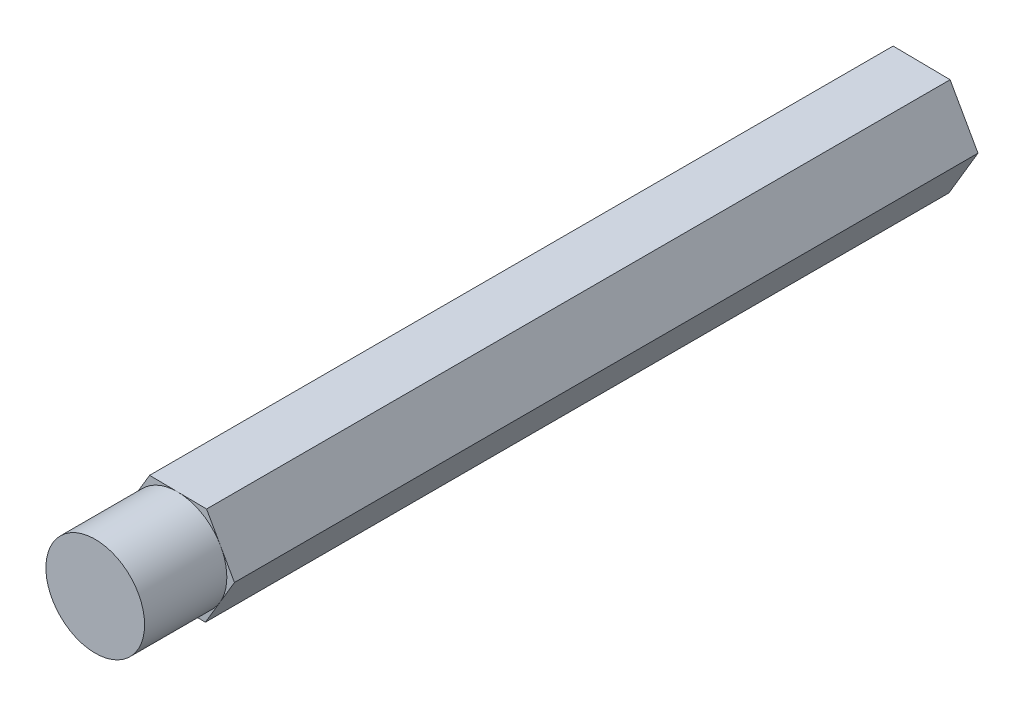
ISO-10303-21;
HEADER;
FILE_DESCRIPTION(('STEP AP214'),'2;1');
FILE_NAME('part.step','',(''),(''),'','','');
FILE_SCHEMA(('AUTOMOTIVE_DESIGN { 1 0 10303 214 1 1 1 1 }'));
ENDSEC;
DATA;
#1=APPLICATION_CONTEXT('core data for automotive mechanical design processes');
#2=APPLICATION_PROTOCOL_DEFINITION('international standard','automotive_design',2000,#1);
#3=PRODUCT_CONTEXT('',#1,'mechanical');
#4=PRODUCT('Part','Part','',(#3));
#5=PRODUCT_RELATED_PRODUCT_CATEGORY('part','',(#4));
#6=PRODUCT_DEFINITION_FORMATION('','',#4);
#7=PRODUCT_DEFINITION_CONTEXT('part definition',#1,'design');
#8=PRODUCT_DEFINITION('design','',#6,#7);
#9=PRODUCT_DEFINITION_SHAPE('','',#8);
#10=(LENGTH_UNIT() NAMED_UNIT(*) SI_UNIT(.MILLI.,.METRE.));
#11=(NAMED_UNIT(*) PLANE_ANGLE_UNIT() SI_UNIT($,.RADIAN.));
#12=(NAMED_UNIT(*) SI_UNIT($,.STERADIAN.) SOLID_ANGLE_UNIT());
#13=UNCERTAINTY_MEASURE_WITH_UNIT(LENGTH_MEASURE(1.E-05),#10,'distance_accuracy_value','');
#14=(GEOMETRIC_REPRESENTATION_CONTEXT(3) GLOBAL_UNCERTAINTY_ASSIGNED_CONTEXT((#13)) GLOBAL_UNIT_ASSIGNED_CONTEXT((#10,
#11,#12)) REPRESENTATION_CONTEXT('',''));
#15=CARTESIAN_POINT('',(0.,0.,0.));
#16=DIRECTION('',(0.,0.,1.));
#17=DIRECTION('',(1.,0.,0.));
#18=AXIS2_PLACEMENT_3D('',#15,#16,#17);
#19=CARTESIAN_POINT('',(5.49886117806557,-0.0663381064198323,79.7052));
#20=DIRECTION('',(-0.871993937270013,-0.489516673224049,0.));
#21=DIRECTION('',(0.489516673224049,-0.871993937270013,0.));
#22=AXIS2_PLACEMENT_3D('',#19,#20,#21);
#23=PLANE('',#22);
#24=DIRECTION('',(-0.489516673224049,0.871993937270013,0.));
#25=VECTOR('',#24,1.);
#26=CARTESIAN_POINT('',(5.49886117806557,-0.0663381064198323,71.7677));
#27=LINE('',#26,#25);
#28=CARTESIAN_POINT('',(5.49886117806557,-0.066338106419836,71.7677));
#29=VERTEX_POINT('',#28);
#30=CARTESIAN_POINT('',(4.15287112624844,2.33132315622953,71.7677));
#31=VERTEX_POINT('',#30);
#32=EDGE_CURVE('E105',#29,#31,#27,.T.);
#33=ORIENTED_EDGE('',*,*,#32,.F.);
#34=DIRECTION('',(0.,0.,-1.));
#35=VECTOR('',#34,1.);
#36=CARTESIAN_POINT('',(5.49886117806557,-0.0663381064198323,79.7052));
#37=LINE('',#36,#35);
#38=CARTESIAN_POINT('',(5.49886117806557,-0.0663381064198323,0.));
#39=VERTEX_POINT('',#38);
#40=EDGE_CURVE('E55',#29,#39,#37,.T.);
#41=ORIENTED_EDGE('',*,*,#40,.T.);
#42=DIRECTION('',(-0.489516673224049,0.871993937270013,0.));
#43=VECTOR('',#42,1.);
#44=CARTESIAN_POINT('',(5.49886117806557,-0.0663381064198323,0.));
#45=LINE('',#44,#43);
#46=CARTESIAN_POINT('',(2.80688107443131,4.72898441887889,0.));
#47=VERTEX_POINT('',#46);
#48=EDGE_CURVE('E110',#39,#47,#45,.T.);
#49=ORIENTED_EDGE('',*,*,#48,.T.);
#50=DIRECTION('',(0.,0.,-1.));
#51=VECTOR('',#50,1.);
#52=CARTESIAN_POINT('',(2.80688107443131,4.72898441887889,79.7052));
#53=LINE('',#52,#51);
#54=CARTESIAN_POINT('',(2.80688107443131,4.72898441887889,71.7677));
#55=VERTEX_POINT('',#54);
#56=EDGE_CURVE('E128',#55,#47,#53,.T.);
#57=ORIENTED_EDGE('',*,*,#56,.F.);
#58=EDGE_CURVE('E111',#31,#55,#27,.T.);
#59=ORIENTED_EDGE('',*,*,#58,.F.);
#60=EDGE_LOOP('',(#33,#41,#49,#57,#59));
#61=FACE_BOUND('',#60,.T.);
#62=ADVANCED_FACE('F33',(#61),#23,.F.);
#63=CARTESIAN_POINT('',(2.80688107443131,4.72898441887889,79.7052));
#64=DIRECTION('',(-0.0120630940469348,-0.99992723823387,0.));
#65=DIRECTION('',(0.99992723823387,-0.0120630940469349,0.));
#66=AXIS2_PLACEMENT_3D('',#63,#64,#65);
#67=PLANE('',#66);
#68=DIRECTION('',(-0.99992723823387,0.0120630940469349,0.));
#69=VECTOR('',#68,1.);
#70=CARTESIAN_POINT('',(2.80688107443131,4.72898441887889,71.7677));
#71=LINE('',#70,#69);
#72=CARTESIAN_POINT('',(0.0574504853985272,4.76215347208881,71.7677));
#73=VERTEX_POINT('',#72);
#74=EDGE_CURVE('E123',#55,#73,#71,.T.);
#75=ORIENTED_EDGE('',*,*,#74,.F.);
#76=ORIENTED_EDGE('',*,*,#56,.T.);
#77=DIRECTION('',(-0.99992723823387,0.0120630940469348,0.));
#78=VECTOR('',#77,1.);
#79=CARTESIAN_POINT('',(2.80688107443131,4.72898441887889,0.));
#80=LINE('',#79,#78);
#81=CARTESIAN_POINT('',(-2.69198010363425,4.79532252529872,0.));
#82=VERTEX_POINT('',#81);
#83=EDGE_CURVE('E134',#47,#82,#80,.T.);
#84=ORIENTED_EDGE('',*,*,#83,.T.);
#85=DIRECTION('',(0.,0.,-1.));
#86=VECTOR('',#85,1.);
#87=CARTESIAN_POINT('',(-2.69198010363425,4.79532252529872,79.7052));
#88=LINE('',#87,#86);
#89=CARTESIAN_POINT('',(-2.69198010363425,4.79532252529872,71.7677));
#90=VERTEX_POINT('',#89);
#91=EDGE_CURVE('E155',#90,#82,#88,.T.);
#92=ORIENTED_EDGE('',*,*,#91,.F.);
#93=EDGE_CURVE('E129',#73,#90,#71,.T.);
#94=ORIENTED_EDGE('',*,*,#93,.F.);
#95=EDGE_LOOP('',(#75,#76,#84,#92,#94));
#96=FACE_BOUND('',#95,.T.);
#97=ADVANCED_FACE('F175',(#96),#67,.F.);
#98=CARTESIAN_POINT('',(-2.69198010363425,4.79532252529872,79.7052));
#99=DIRECTION('',(0.859930843223078,-0.510410565009822,0.));
#100=DIRECTION('',(0.510410565009822,0.859930843223078,0.));
#101=AXIS2_PLACEMENT_3D('',#98,#99,#100);
#102=PLANE('',#101);
#103=DIRECTION('',(-0.510410565009822,-0.859930843223078,0.));
#104=VECTOR('',#103,1.);
#105=CARTESIAN_POINT('',(-2.69198010363425,4.79532252529872,71.7677));
#106=LINE('',#105,#104);
#107=CARTESIAN_POINT('',(-4.09542064084991,2.43083031585928,71.7677));
#108=VERTEX_POINT('',#107);
#109=EDGE_CURVE('E217',#90,#108,#106,.T.);
#110=ORIENTED_EDGE('',*,*,#109,.F.);
#111=ORIENTED_EDGE('',*,*,#91,.T.);
#112=DIRECTION('',(-0.510410565009822,-0.859930843223078,0.));
#113=VECTOR('',#112,1.);
#114=CARTESIAN_POINT('',(-2.69198010363425,4.79532252529872,0.));
#115=LINE('',#114,#113);
#116=CARTESIAN_POINT('',(-5.49886117806557,0.0663381064198295,0.));
#117=VERTEX_POINT('',#116);
#118=EDGE_CURVE('E137',#82,#117,#115,.T.);
#119=ORIENTED_EDGE('',*,*,#118,.T.);
#120=DIRECTION('',(0.,0.,-1.));
#121=VECTOR('',#120,1.);
#122=CARTESIAN_POINT('',(-5.49886117806557,0.0663381064198295,79.7052));
#123=LINE('',#122,#121);
#124=CARTESIAN_POINT('',(-5.49886117806557,0.0663381064198274,71.7677));
#125=VERTEX_POINT('',#124);
#126=EDGE_CURVE('E153',#125,#117,#123,.T.);
#127=ORIENTED_EDGE('',*,*,#126,.F.);
#128=EDGE_CURVE('E222',#108,#125,#106,.T.);
#129=ORIENTED_EDGE('',*,*,#128,.F.);
#130=EDGE_LOOP('',(#110,#111,#119,#127,#129));
#131=FACE_BOUND('',#130,.T.);
#132=ADVANCED_FACE('F179',(#131),#102,.F.);
#133=CARTESIAN_POINT('',(-5.49886117806557,0.0663381064198295,79.7052));
#134=DIRECTION('',(0.871993937270013,0.489516673224049,0.));
#135=DIRECTION('',(-0.489516673224049,0.871993937270013,0.));
#136=AXIS2_PLACEMENT_3D('',#133,#134,#135);
#137=PLANE('',#136);
#138=DIRECTION('',(0.489516673224049,-0.871993937270013,0.));
#139=VECTOR('',#138,1.);
#140=CARTESIAN_POINT('',(-5.49886117806557,0.0663381064198295,71.7677));
#141=LINE('',#140,#139);
#142=CARTESIAN_POINT('',(-4.15287112624844,-2.33132315622953,71.7677));
#143=VERTEX_POINT('',#142);
#144=EDGE_CURVE('E231',#125,#143,#141,.T.);
#145=ORIENTED_EDGE('',*,*,#144,.F.);
#146=ORIENTED_EDGE('',*,*,#126,.T.);
#147=DIRECTION('',(0.489516673224049,-0.871993937270013,0.));
#148=VECTOR('',#147,1.);
#149=CARTESIAN_POINT('',(-5.49886117806557,0.0663381064198295,0.));
#150=LINE('',#149,#148);
#151=CARTESIAN_POINT('',(-2.80688107443131,-4.72898441887889,0.));
#152=VERTEX_POINT('',#151);
#153=EDGE_CURVE('E140',#117,#152,#150,.T.);
#154=ORIENTED_EDGE('',*,*,#153,.T.);
#155=DIRECTION('',(0.,0.,-1.));
#156=VECTOR('',#155,1.);
#157=CARTESIAN_POINT('',(-2.80688107443131,-4.72898441887889,79.7052));
#158=LINE('',#157,#156);
#159=CARTESIAN_POINT('',(-2.80688107443131,-4.72898441887889,71.7677));
#160=VERTEX_POINT('',#159);
#161=EDGE_CURVE('E151',#160,#152,#158,.T.);
#162=ORIENTED_EDGE('',*,*,#161,.F.);
#163=EDGE_CURVE('E232',#143,#160,#141,.T.);
#164=ORIENTED_EDGE('',*,*,#163,.F.);
#165=EDGE_LOOP('',(#145,#146,#154,#162,#164));
#166=FACE_BOUND('',#165,.T.);
#167=ADVANCED_FACE('F184',(#166),#137,.F.);
#168=CARTESIAN_POINT('',(-2.80688107443131,-4.72898441887889,79.7052));
#169=DIRECTION('',(0.0120630940469353,0.99992723823387,0.));
#170=DIRECTION('',(-0.99992723823387,0.0120630940469353,0.));
#171=AXIS2_PLACEMENT_3D('',#168,#169,#170);
#172=PLANE('',#171);
#173=DIRECTION('',(0.99992723823387,-0.0120630940469353,0.));
#174=VECTOR('',#173,1.);
#175=CARTESIAN_POINT('',(-2.80688107443131,-4.72898441887889,71.7677));
#176=LINE('',#175,#174);
#177=CARTESIAN_POINT('',(-0.0574504853985294,-4.76215347208881,71.7677));
#178=VERTEX_POINT('',#177);
#179=EDGE_CURVE('E235',#160,#178,#176,.T.);
#180=ORIENTED_EDGE('',*,*,#179,.F.);
#181=ORIENTED_EDGE('',*,*,#161,.T.);
#182=DIRECTION('',(0.99992723823387,-0.0120630940469353,0.));
#183=VECTOR('',#182,1.);
#184=CARTESIAN_POINT('',(-2.80688107443131,-4.72898441887889,0.));
#185=LINE('',#184,#183);
#186=CARTESIAN_POINT('',(2.69198010363426,-4.79532252529872,0.));
#187=VERTEX_POINT('',#186);
#188=EDGE_CURVE('E143',#152,#187,#185,.T.);
#189=ORIENTED_EDGE('',*,*,#188,.T.);
#190=DIRECTION('',(0.,0.,-1.));
#191=VECTOR('',#190,1.);
#192=CARTESIAN_POINT('',(2.69198010363426,-4.79532252529872,79.7052));
#193=LINE('',#192,#191);
#194=CARTESIAN_POINT('',(2.69198010363426,-4.79532252529872,71.7677));
#195=VERTEX_POINT('',#194);
#196=EDGE_CURVE('E149',#195,#187,#193,.T.);
#197=ORIENTED_EDGE('',*,*,#196,.F.);
#198=EDGE_CURVE('E125',#178,#195,#176,.T.);
#199=ORIENTED_EDGE('',*,*,#198,.F.);
#200=EDGE_LOOP('',(#180,#181,#189,#197,#199));
#201=FACE_BOUND('',#200,.T.);
#202=ADVANCED_FACE('F190',(#201),#172,.F.);
#203=CARTESIAN_POINT('',(2.69198010363426,-4.79532252529872,79.7052));
#204=DIRECTION('',(-0.859930843223078,0.510410565009822,0.));
#205=DIRECTION('',(-0.510410565009822,-0.859930843223078,0.));
#206=AXIS2_PLACEMENT_3D('',#203,#204,#205);
#207=PLANE('',#206);
#208=DIRECTION('',(0.510410565009822,0.859930843223078,0.));
#209=VECTOR('',#208,1.);
#210=CARTESIAN_POINT('',(2.69198010363426,-4.79532252529872,71.7677));
#211=LINE('',#210,#209);
#212=CARTESIAN_POINT('',(4.09542064084991,-2.43083031585928,71.7677));
#213=VERTEX_POINT('',#212);
#214=EDGE_CURVE('E11',#195,#213,#211,.T.);
#215=ORIENTED_EDGE('',*,*,#214,.F.);
#216=ORIENTED_EDGE('',*,*,#196,.T.);
#217=DIRECTION('',(0.510410565009822,0.859930843223078,0.));
#218=VECTOR('',#217,1.);
#219=CARTESIAN_POINT('',(2.69198010363426,-4.79532252529872,0.));
#220=LINE('',#219,#218);
#221=EDGE_CURVE('E146',#187,#39,#220,.T.);
#222=ORIENTED_EDGE('',*,*,#221,.T.);
#223=ORIENTED_EDGE('',*,*,#40,.F.);
#224=EDGE_CURVE('E36',#213,#29,#211,.T.);
#225=ORIENTED_EDGE('',*,*,#224,.F.);
#226=EDGE_LOOP('',(#215,#216,#222,#223,#225));
#227=FACE_BOUND('',#226,.T.);
#228=ADVANCED_FACE('F194',(#227),#207,.F.);
#229=CARTESIAN_POINT('',(0.,0.,0.));
#230=DIRECTION('',(0.,0.,1.));
#231=DIRECTION('',(1.,0.,0.));
#232=AXIS2_PLACEMENT_3D('',#229,#230,#231);
#233=PLANE('',#232);
#234=ORIENTED_EDGE('',*,*,#48,.F.);
#235=ORIENTED_EDGE('',*,*,#221,.F.);
#236=ORIENTED_EDGE('',*,*,#188,.F.);
#237=ORIENTED_EDGE('',*,*,#153,.F.);
#238=ORIENTED_EDGE('',*,*,#118,.F.);
#239=ORIENTED_EDGE('',*,*,#83,.F.);
#240=EDGE_LOOP('',(#234,#235,#236,#237,#238,#239));
#241=FACE_BOUND('',#240,.T.);
#242=ADVANCED_FACE('F198',(#241),#233,.F.);
#243=CARTESIAN_POINT('',(0.,0.,71.7677));
#244=DIRECTION('',(0.,0.,1.));
#245=DIRECTION('',(1.,0.,0.));
#246=AXIS2_PLACEMENT_3D('',#243,#244,#245);
#247=PLANE('',#246);
#248=ORIENTED_EDGE('',*,*,#32,.T.);
#249=CARTESIAN_POINT('',(0.,0.,71.7677));
#250=DIRECTION('',(0.,0.,1.));
#251=DIRECTION('',(1.,0.,0.));
#252=AXIS2_PLACEMENT_3D('',#249,#250,#251);
#253=CIRCLE('',#252,4.7625);
#254=EDGE_CURVE('E107',#213,#31,#253,.T.);
#255=ORIENTED_EDGE('',*,*,#254,.F.);
#256=ORIENTED_EDGE('',*,*,#224,.T.);
#257=EDGE_LOOP('',(#248,#255,#256));
#258=FACE_BOUND('',#257,.T.);
#259=ADVANCED_FACE('F106',(#258),#247,.T.);
#260=ORIENTED_EDGE('',*,*,#58,.T.);
#261=ORIENTED_EDGE('',*,*,#74,.T.);
#262=EDGE_CURVE('E117',#31,#73,#253,.T.);
#263=ORIENTED_EDGE('',*,*,#262,.F.);
#264=EDGE_LOOP('',(#260,#261,#263));
#265=FACE_BOUND('',#264,.T.);
#266=ADVANCED_FACE('F121',(#265),#247,.T.);
#267=ORIENTED_EDGE('',*,*,#93,.T.);
#268=ORIENTED_EDGE('',*,*,#109,.T.);
#269=EDGE_CURVE('E126',#73,#108,#253,.T.);
#270=ORIENTED_EDGE('',*,*,#269,.F.);
#271=EDGE_LOOP('',(#267,#268,#270));
#272=FACE_BOUND('',#271,.T.);
#273=ADVANCED_FACE('F206',(#272),#247,.T.);
#274=ORIENTED_EDGE('',*,*,#128,.T.);
#275=ORIENTED_EDGE('',*,*,#144,.T.);
#276=EDGE_CURVE('E243',#108,#143,#253,.T.);
#277=ORIENTED_EDGE('',*,*,#276,.F.);
#278=EDGE_LOOP('',(#274,#275,#277));
#279=FACE_BOUND('',#278,.T.);
#280=ADVANCED_FACE('F210',(#279),#247,.T.);
#281=ORIENTED_EDGE('',*,*,#163,.T.);
#282=ORIENTED_EDGE('',*,*,#179,.T.);
#283=EDGE_CURVE('E241',#143,#178,#253,.T.);
#284=ORIENTED_EDGE('',*,*,#283,.F.);
#285=EDGE_LOOP('',(#281,#282,#284));
#286=FACE_BOUND('',#285,.T.);
#287=ADVANCED_FACE('F171',(#286),#247,.T.);
#288=ORIENTED_EDGE('',*,*,#198,.T.);
#289=ORIENTED_EDGE('',*,*,#214,.T.);
#290=EDGE_CURVE('E47',#178,#213,#253,.T.);
#291=ORIENTED_EDGE('',*,*,#290,.F.);
#292=EDGE_LOOP('',(#288,#289,#291));
#293=FACE_BOUND('',#292,.T.);
#294=ADVANCED_FACE('F164',(#293),#247,.T.);
#295=CARTESIAN_POINT('',(0.,0.,71.7677));
#296=DIRECTION('',(0.,0.,1.));
#297=DIRECTION('',(1.,0.,0.));
#298=AXIS2_PLACEMENT_3D('',#295,#296,#297);
#299=CYLINDRICAL_SURFACE('',#298,4.7625);
#300=CARTESIAN_POINT('',(0.,0.,79.7052));
#301=DIRECTION('',(0.,0.,1.));
#302=DIRECTION('',(1.,0.,0.));
#303=AXIS2_PLACEMENT_3D('',#300,#301,#302);
#304=CIRCLE('',#303,4.7625);
#305=CARTESIAN_POINT('',(4.7625,0.,79.7052));
#306=VERTEX_POINT('',#305);
#307=EDGE_CURVE('E157',#306,#306,#304,.T.);
#308=ORIENTED_EDGE('',*,*,#307,.F.);
#309=EDGE_LOOP('',(#308));
#310=FACE_BOUND('',#309,.T.);
#311=ORIENTED_EDGE('',*,*,#254,.T.);
#312=ORIENTED_EDGE('',*,*,#262,.T.);
#313=ORIENTED_EDGE('',*,*,#269,.T.);
#314=ORIENTED_EDGE('',*,*,#276,.T.);
#315=ORIENTED_EDGE('',*,*,#283,.T.);
#316=ORIENTED_EDGE('',*,*,#290,.T.);
#317=EDGE_LOOP('',(#311,#312,#313,#314,#315,#316));
#318=FACE_BOUND('',#317,.T.);
#319=ADVANCED_FACE('F115',(#310,#318),#299,.T.);
#320=CARTESIAN_POINT('',(0.,0.,79.7052));
#321=DIRECTION('',(0.,0.,1.));
#322=DIRECTION('',(1.,0.,0.));
#323=AXIS2_PLACEMENT_3D('',#320,#321,#322);
#324=PLANE('',#323);
#325=ORIENTED_EDGE('',*,*,#307,.T.);
#326=EDGE_LOOP('',(#325));
#327=FACE_BOUND('',#326,.T.);
#328=ADVANCED_FACE('F161',(#327),#324,.T.);
#329=CLOSED_SHELL('',(#62,#97,#132,#167,#202,#228,#242,#259,#266,#273,#280,#287,#294,#319,#328));
#330=MANIFOLD_SOLID_BREP('B2',#329);
#331=ADVANCED_BREP_SHAPE_REPRESENTATION('',(#18,#330),#14);
#332=SHAPE_DEFINITION_REPRESENTATION(#9,#331);
ENDSEC;
END-ISO-10303-21;
